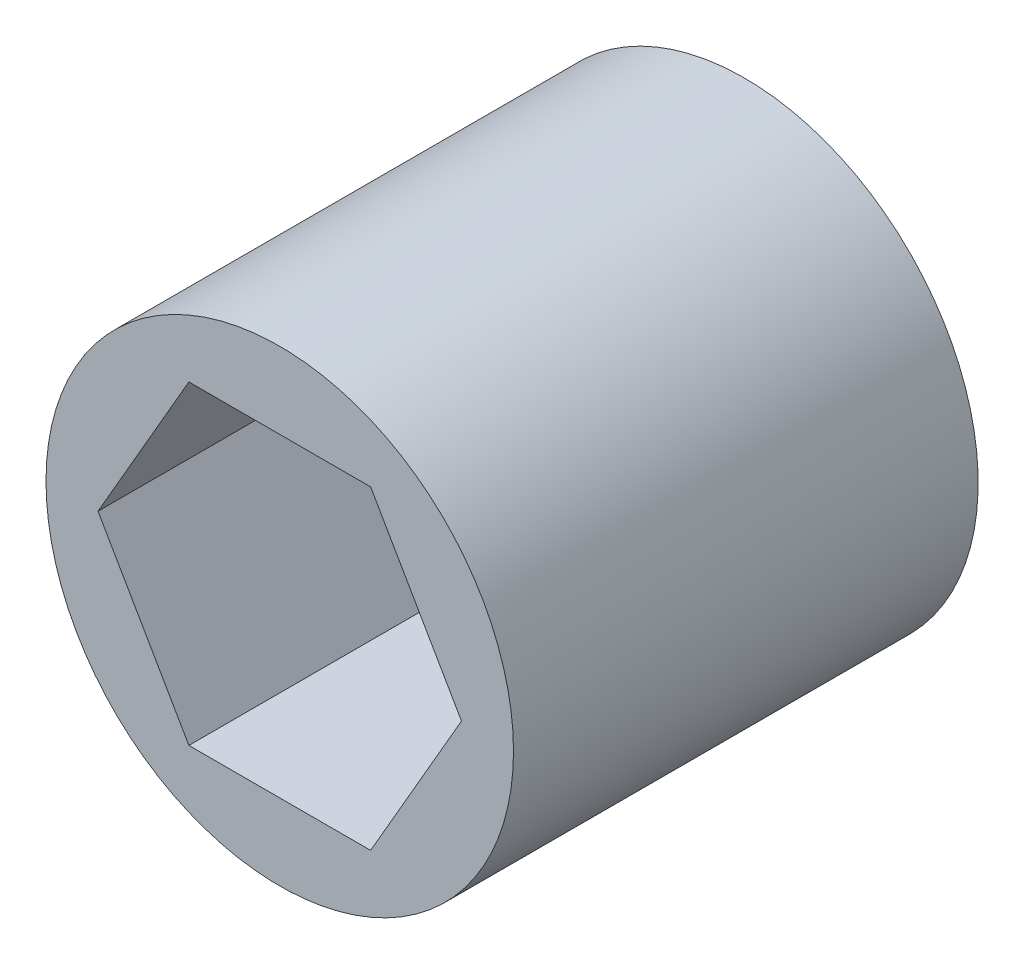
ISO-10303-21;
HEADER;
FILE_DESCRIPTION(('STEP AP214'),'2;1');
FILE_NAME('part.step','',(''),(''),'','','');
FILE_SCHEMA(('AUTOMOTIVE_DESIGN { 1 0 10303 214 1 1 1 1 }'));
ENDSEC;
DATA;
#1=APPLICATION_CONTEXT('core data for automotive mechanical design processes');
#2=APPLICATION_PROTOCOL_DEFINITION('international standard','automotive_design',2000,#1);
#3=PRODUCT_CONTEXT('',#1,'mechanical');
#4=PRODUCT('Part','Part','',(#3));
#5=PRODUCT_RELATED_PRODUCT_CATEGORY('part','',(#4));
#6=PRODUCT_DEFINITION_FORMATION('','',#4);
#7=PRODUCT_DEFINITION_CONTEXT('part definition',#1,'design');
#8=PRODUCT_DEFINITION('design','',#6,#7);
#9=PRODUCT_DEFINITION_SHAPE('','',#8);
#10=(LENGTH_UNIT() NAMED_UNIT(*) SI_UNIT(.MILLI.,.METRE.));
#11=(NAMED_UNIT(*) PLANE_ANGLE_UNIT() SI_UNIT($,.RADIAN.));
#12=(NAMED_UNIT(*) SI_UNIT($,.STERADIAN.) SOLID_ANGLE_UNIT());
#13=UNCERTAINTY_MEASURE_WITH_UNIT(LENGTH_MEASURE(1.E-05),#10,'distance_accuracy_value','');
#14=(GEOMETRIC_REPRESENTATION_CONTEXT(3) GLOBAL_UNCERTAINTY_ASSIGNED_CONTEXT((#13)) GLOBAL_UNIT_ASSIGNED_CONTEXT((#10,
#11,#12)) REPRESENTATION_CONTEXT('',''));
#15=CARTESIAN_POINT('',(0.,0.,0.));
#16=DIRECTION('',(0.,0.,1.));
#17=DIRECTION('',(1.,0.,0.));
#18=AXIS2_PLACEMENT_3D('',#15,#16,#17);
#19=CARTESIAN_POINT('',(0.,0.,12.6244047619048));
#20=DIRECTION('',(0.,0.,-1.));
#21=DIRECTION('',(-1.,0.,0.));
#22=AXIS2_PLACEMENT_3D('',#19,#20,#21);
#23=CYLINDRICAL_SURFACE('',#22,9.525);
#24=CARTESIAN_POINT('',(0.,0.,12.6244047619048));
#25=DIRECTION('',(0.,0.,1.));
#26=DIRECTION('',(1.,0.,0.));
#27=AXIS2_PLACEMENT_3D('',#24,#25,#26);
#28=CIRCLE('',#27,9.525);
#29=CARTESIAN_POINT('',(9.525,0.,12.6244047619048));
#30=VERTEX_POINT('',#29);
#31=EDGE_CURVE('E11',#30,#30,#28,.T.);
#32=ORIENTED_EDGE('',*,*,#31,.F.);
#33=EDGE_LOOP('',(#32));
#34=FACE_BOUND('',#33,.T.);
#35=CARTESIAN_POINT('',(0.,0.,-6.31));
#36=DIRECTION('',(0.,0.,-1.));
#37=DIRECTION('',(-1.,0.,0.));
#38=AXIS2_PLACEMENT_3D('',#35,#36,#37);
#39=CIRCLE('',#38,9.525);
#40=CARTESIAN_POINT('',(-9.525,0.,-6.31));
#41=VERTEX_POINT('',#40);
#42=EDGE_CURVE('E137',#41,#41,#39,.T.);
#43=ORIENTED_EDGE('',*,*,#42,.F.);
#44=EDGE_LOOP('',(#43));
#45=FACE_BOUND('',#44,.T.);
#46=ADVANCED_FACE('F45',(#34,#45),#23,.T.);
#47=CARTESIAN_POINT('',(0.,0.,12.6244047619048));
#48=DIRECTION('',(0.,0.,1.));
#49=DIRECTION('',(1.,0.,0.));
#50=AXIS2_PLACEMENT_3D('',#47,#48,#49);
#51=PLANE('',#50);
#52=DIRECTION('',(-0.5,0.866025403784439,0.));
#53=VECTOR('',#52,1.);
#54=CARTESIAN_POINT('',(5.5542539271715,3.20675,12.6244047619048));
#55=LINE('',#54,#53);
#56=CARTESIAN_POINT('',(7.40567190289533,0.,12.6244047619048));
#57=VERTEX_POINT('',#56);
#58=CARTESIAN_POINT('',(3.70283595144766,6.4135,12.6244047619048));
#59=VERTEX_POINT('',#58);
#60=EDGE_CURVE('E102',#57,#59,#55,.T.);
#61=ORIENTED_EDGE('',*,*,#60,.F.);
#62=DIRECTION('',(0.5,0.866025403784438,0.));
#63=VECTOR('',#62,1.);
#64=CARTESIAN_POINT('',(5.5542539271715,-3.20675,12.6244047619048));
#65=LINE('',#64,#63);
#66=CARTESIAN_POINT('',(3.70283595144766,-6.4135,12.6244047619048));
#67=VERTEX_POINT('',#66);
#68=EDGE_CURVE('E156',#67,#57,#65,.T.);
#69=ORIENTED_EDGE('',*,*,#68,.F.);
#70=DIRECTION('',(1.,0.,0.));
#71=VECTOR('',#70,1.);
#72=CARTESIAN_POINT('',(0.,-6.4135,12.6244047619048));
#73=LINE('',#72,#71);
#74=CARTESIAN_POINT('',(-3.70283595144766,-6.4135,12.6244047619048));
#75=VERTEX_POINT('',#74);
#76=EDGE_CURVE('E60',#75,#67,#73,.T.);
#77=ORIENTED_EDGE('',*,*,#76,.F.);
#78=DIRECTION('',(0.5,-0.866025403784439,0.));
#79=VECTOR('',#78,1.);
#80=CARTESIAN_POINT('',(-5.5542539271715,-3.20675,12.6244047619048));
#81=LINE('',#80,#79);
#82=CARTESIAN_POINT('',(-7.40567190289533,0.,12.6244047619048));
#83=VERTEX_POINT('',#82);
#84=EDGE_CURVE('E150',#83,#75,#81,.T.);
#85=ORIENTED_EDGE('',*,*,#84,.F.);
#86=DIRECTION('',(-0.5,-0.866025403784439,0.));
#87=VECTOR('',#86,1.);
#88=CARTESIAN_POINT('',(-5.5542539271715,3.20675,12.6244047619048));
#89=LINE('',#88,#87);
#90=CARTESIAN_POINT('',(-3.70283595144766,6.4135,12.6244047619048));
#91=VERTEX_POINT('',#90);
#92=EDGE_CURVE('E146',#91,#83,#89,.T.);
#93=ORIENTED_EDGE('',*,*,#92,.F.);
#94=DIRECTION('',(-1.,0.,0.));
#95=VECTOR('',#94,1.);
#96=CARTESIAN_POINT('',(0.,6.4135,12.6244047619048));
#97=LINE('',#96,#95);
#98=EDGE_CURVE('E143',#59,#91,#97,.T.);
#99=ORIENTED_EDGE('',*,*,#98,.F.);
#100=EDGE_LOOP('',(#61,#69,#77,#85,#93,#99));
#101=FACE_BOUND('',#100,.T.);
#102=ORIENTED_EDGE('',*,*,#31,.T.);
#103=EDGE_LOOP('',(#102));
#104=FACE_BOUND('',#103,.T.);
#105=ADVANCED_FACE('F175',(#101,#104),#51,.T.);
#106=CARTESIAN_POINT('',(5.5542539271715,3.20675,-0.00200000000000027));
#107=DIRECTION('',(0.866025403784439,0.5,0.));
#108=DIRECTION('',(-0.5,0.866025403784439,0.));
#109=AXIS2_PLACEMENT_3D('',#106,#107,#108);
#110=PLANE('',#109);
#111=DIRECTION('',(0.,0.,1.));
#112=VECTOR('',#111,1.);
#113=CARTESIAN_POINT('',(3.70283595144766,6.4135,-0.00200000000000027));
#114=LINE('',#113,#112);
#115=CARTESIAN_POINT('',(3.70283595144766,6.4135,-6.31));
#116=VERTEX_POINT('',#115);
#117=EDGE_CURVE('E53',#116,#59,#114,.T.);
#118=ORIENTED_EDGE('',*,*,#117,.F.);
#119=DIRECTION('',(0.5,-0.866025403784439,0.));
#120=VECTOR('',#119,1.);
#121=CARTESIAN_POINT('',(3.70283595144766,6.4135,-6.31));
#122=LINE('',#121,#120);
#123=CARTESIAN_POINT('',(7.40567190289533,0.,-6.31));
#124=VERTEX_POINT('',#123);
#125=EDGE_CURVE('E99',#116,#124,#122,.T.);
#126=ORIENTED_EDGE('',*,*,#125,.T.);
#127=DIRECTION('',(0.,0.,1.));
#128=VECTOR('',#127,1.);
#129=CARTESIAN_POINT('',(7.40567190289533,0.,-0.00200000000000027));
#130=LINE('',#129,#128);
#131=EDGE_CURVE('E68',#124,#57,#130,.T.);
#132=ORIENTED_EDGE('',*,*,#131,.T.);
#133=ORIENTED_EDGE('',*,*,#60,.T.);
#134=EDGE_LOOP('',(#118,#126,#132,#133));
#135=FACE_BOUND('',#134,.T.);
#136=ADVANCED_FACE('F97',(#135),#110,.F.);
#137=CARTESIAN_POINT('',(0.,6.4135,-0.00200000000000027));
#138=DIRECTION('',(0.,1.,0.));
#139=DIRECTION('',(0.,0.,1.));
#140=AXIS2_PLACEMENT_3D('',#137,#138,#139);
#141=PLANE('',#140);
#142=DIRECTION('',(0.,0.,1.));
#143=VECTOR('',#142,1.);
#144=CARTESIAN_POINT('',(-3.70283595144766,6.4135,-0.00200000000000027));
#145=LINE('',#144,#143);
#146=CARTESIAN_POINT('',(-3.70283595144766,6.4135,-6.31));
#147=VERTEX_POINT('',#146);
#148=EDGE_CURVE('E107',#147,#91,#145,.T.);
#149=ORIENTED_EDGE('',*,*,#148,.F.);
#150=DIRECTION('',(1.,0.,0.));
#151=VECTOR('',#150,1.);
#152=CARTESIAN_POINT('',(-3.70283595144766,6.4135,-6.31));
#153=LINE('',#152,#151);
#154=EDGE_CURVE('E109',#147,#116,#153,.T.);
#155=ORIENTED_EDGE('',*,*,#154,.T.);
#156=ORIENTED_EDGE('',*,*,#117,.T.);
#157=ORIENTED_EDGE('',*,*,#98,.T.);
#158=EDGE_LOOP('',(#149,#155,#156,#157));
#159=FACE_BOUND('',#158,.T.);
#160=ADVANCED_FACE('F110',(#159),#141,.F.);
#161=CARTESIAN_POINT('',(-5.5542539271715,3.20675,-0.00200000000000027));
#162=DIRECTION('',(-0.866025403784439,0.5,0.));
#163=DIRECTION('',(-0.5,-0.866025403784439,0.));
#164=AXIS2_PLACEMENT_3D('',#161,#162,#163);
#165=PLANE('',#164);
#166=DIRECTION('',(0.,0.,1.));
#167=VECTOR('',#166,1.);
#168=CARTESIAN_POINT('',(-7.40567190289533,0.,-0.00200000000000027));
#169=LINE('',#168,#167);
#170=CARTESIAN_POINT('',(-7.40567190289533,0.,-6.31));
#171=VERTEX_POINT('',#170);
#172=EDGE_CURVE('E166',#171,#83,#169,.T.);
#173=ORIENTED_EDGE('',*,*,#172,.F.);
#174=DIRECTION('',(0.5,0.866025403784439,0.));
#175=VECTOR('',#174,1.);
#176=CARTESIAN_POINT('',(-7.40567190289533,0.,-6.31));
#177=LINE('',#176,#175);
#178=EDGE_CURVE('E134',#171,#147,#177,.T.);
#179=ORIENTED_EDGE('',*,*,#178,.T.);
#180=ORIENTED_EDGE('',*,*,#148,.T.);
#181=ORIENTED_EDGE('',*,*,#92,.T.);
#182=EDGE_LOOP('',(#173,#179,#180,#181));
#183=FACE_BOUND('',#182,.T.);
#184=ADVANCED_FACE('F171',(#183),#165,.F.);
#185=CARTESIAN_POINT('',(-5.5542539271715,-3.20675,-0.00200000000000027));
#186=DIRECTION('',(-0.866025403784439,-0.5,0.));
#187=DIRECTION('',(0.5,-0.866025403784439,0.));
#188=AXIS2_PLACEMENT_3D('',#185,#186,#187);
#189=PLANE('',#188);
#190=DIRECTION('',(0.,0.,1.));
#191=VECTOR('',#190,1.);
#192=CARTESIAN_POINT('',(-3.70283595144766,-6.4135,-0.00200000000000027));
#193=LINE('',#192,#191);
#194=CARTESIAN_POINT('',(-3.70283595144766,-6.4135,-6.31));
#195=VERTEX_POINT('',#194);
#196=EDGE_CURVE('E163',#195,#75,#193,.T.);
#197=ORIENTED_EDGE('',*,*,#196,.F.);
#198=DIRECTION('',(-0.5,0.866025403784439,0.));
#199=VECTOR('',#198,1.);
#200=CARTESIAN_POINT('',(-3.70283595144766,-6.4135,-6.31));
#201=LINE('',#200,#199);
#202=EDGE_CURVE('E130',#195,#171,#201,.T.);
#203=ORIENTED_EDGE('',*,*,#202,.T.);
#204=ORIENTED_EDGE('',*,*,#172,.T.);
#205=ORIENTED_EDGE('',*,*,#84,.T.);
#206=EDGE_LOOP('',(#197,#203,#204,#205));
#207=FACE_BOUND('',#206,.T.);
#208=ADVANCED_FACE('F179',(#207),#189,.F.);
#209=CARTESIAN_POINT('',(0.,-6.4135,-0.00200000000000027));
#210=DIRECTION('',(0.,-1.,0.));
#211=DIRECTION('',(1.,0.,0.));
#212=AXIS2_PLACEMENT_3D('',#209,#210,#211);
#213=PLANE('',#212);
#214=DIRECTION('',(0.,0.,1.));
#215=VECTOR('',#214,1.);
#216=CARTESIAN_POINT('',(3.70283595144766,-6.4135,-0.00200000000000027));
#217=LINE('',#216,#215);
#218=CARTESIAN_POINT('',(3.70283595144766,-6.4135,-6.31));
#219=VERTEX_POINT('',#218);
#220=EDGE_CURVE('E160',#219,#67,#217,.T.);
#221=ORIENTED_EDGE('',*,*,#220,.F.);
#222=DIRECTION('',(-1.,0.,0.));
#223=VECTOR('',#222,1.);
#224=CARTESIAN_POINT('',(3.70283595144766,-6.4135,-6.31));
#225=LINE('',#224,#223);
#226=EDGE_CURVE('E124',#219,#195,#225,.T.);
#227=ORIENTED_EDGE('',*,*,#226,.T.);
#228=ORIENTED_EDGE('',*,*,#196,.T.);
#229=ORIENTED_EDGE('',*,*,#76,.T.);
#230=EDGE_LOOP('',(#221,#227,#228,#229));
#231=FACE_BOUND('',#230,.T.);
#232=ADVANCED_FACE('F181',(#231),#213,.F.);
#233=CARTESIAN_POINT('',(5.5542539271715,-3.20675,-0.00200000000000027));
#234=DIRECTION('',(0.866025403784438,-0.5,0.));
#235=DIRECTION('',(0.5,0.866025403784439,0.));
#236=AXIS2_PLACEMENT_3D('',#233,#234,#235);
#237=PLANE('',#236);
#238=ORIENTED_EDGE('',*,*,#131,.F.);
#239=DIRECTION('',(-0.5,-0.866025403784438,0.));
#240=VECTOR('',#239,1.);
#241=CARTESIAN_POINT('',(7.40567190289533,0.,-6.31));
#242=LINE('',#241,#240);
#243=EDGE_CURVE('E119',#124,#219,#242,.T.);
#244=ORIENTED_EDGE('',*,*,#243,.T.);
#245=ORIENTED_EDGE('',*,*,#220,.T.);
#246=ORIENTED_EDGE('',*,*,#68,.T.);
#247=EDGE_LOOP('',(#238,#244,#245,#246));
#248=FACE_BOUND('',#247,.T.);
#249=ADVANCED_FACE('F183',(#248),#237,.F.);
#250=CARTESIAN_POINT('',(0.,0.,-6.31));
#251=DIRECTION('',(0.,0.,-1.));
#252=DIRECTION('',(-1.,0.,0.));
#253=AXIS2_PLACEMENT_3D('',#250,#251,#252);
#254=PLANE('',#253);
#255=ORIENTED_EDGE('',*,*,#42,.T.);
#256=EDGE_LOOP('',(#255));
#257=FACE_BOUND('',#256,.T.);
#258=ORIENTED_EDGE('',*,*,#125,.F.);
#259=ORIENTED_EDGE('',*,*,#154,.F.);
#260=ORIENTED_EDGE('',*,*,#178,.F.);
#261=ORIENTED_EDGE('',*,*,#202,.F.);
#262=ORIENTED_EDGE('',*,*,#226,.F.);
#263=ORIENTED_EDGE('',*,*,#243,.F.);
#264=EDGE_LOOP('',(#258,#259,#260,#261,#262,#263));
#265=FACE_BOUND('',#264,.T.);
#266=ADVANCED_FACE('F116',(#257,#265),#254,.T.);
#267=CLOSED_SHELL('',(#46,#105,#136,#160,#184,#208,#232,#249,#266));
#268=MANIFOLD_SOLID_BREP('B2',#267);
#269=ADVANCED_BREP_SHAPE_REPRESENTATION('',(#18,#268),#14);
#270=SHAPE_DEFINITION_REPRESENTATION(#9,#269);
ENDSEC;
END-ISO-10303-21;
